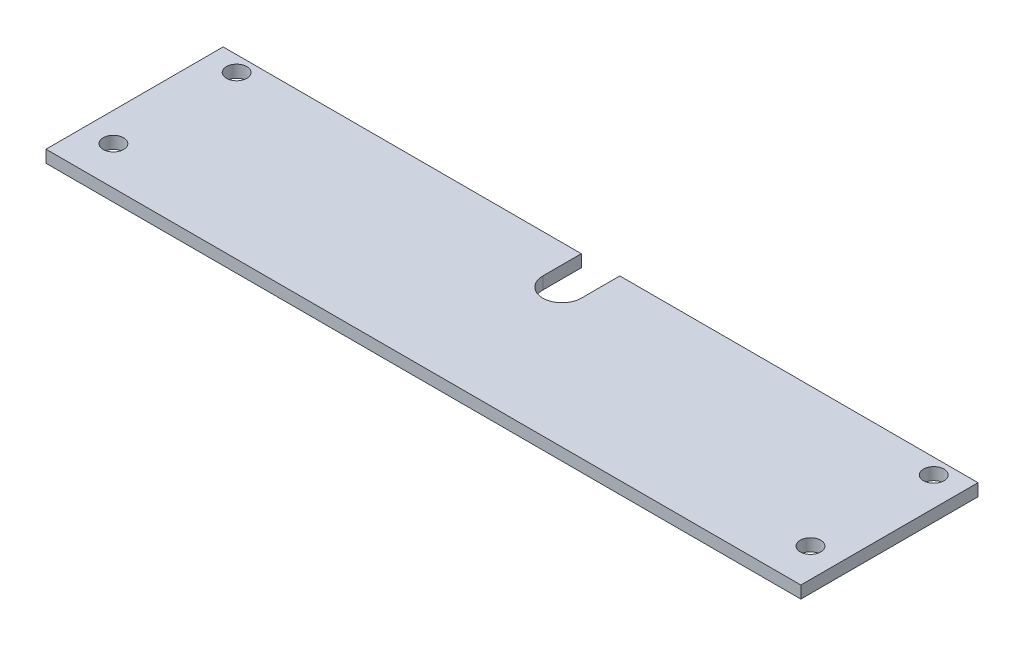
ISO-10303-21;
HEADER;
FILE_DESCRIPTION(('STEP AP214'),'2;1');
FILE_NAME('part.step','',(''),(''),'','','');
FILE_SCHEMA(('AUTOMOTIVE_DESIGN { 1 0 10303 214 1 1 1 1 }'));
ENDSEC;
DATA;
#1=APPLICATION_CONTEXT('core data for automotive mechanical design processes');
#2=APPLICATION_PROTOCOL_DEFINITION('international standard','automotive_design',2000,#1);
#3=PRODUCT_CONTEXT('',#1,'mechanical');
#4=PRODUCT('Part','Part','',(#3));
#5=PRODUCT_RELATED_PRODUCT_CATEGORY('part','',(#4));
#6=PRODUCT_DEFINITION_FORMATION('','',#4);
#7=PRODUCT_DEFINITION_CONTEXT('part definition',#1,'design');
#8=PRODUCT_DEFINITION('design','',#6,#7);
#9=PRODUCT_DEFINITION_SHAPE('','',#8);
#10=(LENGTH_UNIT() NAMED_UNIT(*) SI_UNIT(.MILLI.,.METRE.));
#11=(NAMED_UNIT(*) PLANE_ANGLE_UNIT() SI_UNIT($,.RADIAN.));
#12=(NAMED_UNIT(*) SI_UNIT($,.STERADIAN.) SOLID_ANGLE_UNIT());
#13=UNCERTAINTY_MEASURE_WITH_UNIT(LENGTH_MEASURE(1.E-05),#10,'distance_accuracy_value','');
#14=(GEOMETRIC_REPRESENTATION_CONTEXT(3) GLOBAL_UNCERTAINTY_ASSIGNED_CONTEXT((#13)) GLOBAL_UNIT_ASSIGNED_CONTEXT((#10,
#11,#12)) REPRESENTATION_CONTEXT('',''));
#15=CARTESIAN_POINT('',(0.,0.,0.));
#16=DIRECTION('',(0.,0.,1.));
#17=DIRECTION('',(1.,0.,0.));
#18=AXIS2_PLACEMENT_3D('',#15,#16,#17);
#19=CARTESIAN_POINT('',(0.,3.175,0.));
#20=DIRECTION('',(0.,-1.,0.));
#21=DIRECTION('',(0.,0.,-1.));
#22=AXIS2_PLACEMENT_3D('',#19,#20,#21);
#23=PLANE('',#22);
#24=CARTESIAN_POINT('',(188.5,3.175,-10.));
#25=DIRECTION('',(0.,1.,0.));
#26=DIRECTION('',(0.,0.,1.));
#27=AXIS2_PLACEMENT_3D('',#24,#25,#26);
#28=CIRCLE('',#27,2.65000000000001);
#29=CARTESIAN_POINT('',(188.5,3.175,-7.34999999999999));
#30=VERTEX_POINT('',#29);
#31=EDGE_CURVE('E247',#30,#30,#28,.T.);
#32=ORIENTED_EDGE('',*,*,#31,.F.);
#33=EDGE_LOOP('',(#32));
#34=FACE_BOUND('',#33,.T.);
#35=CARTESIAN_POINT('',(7.5,3.175,-42.));
#36=DIRECTION('',(0.,1.,0.));
#37=DIRECTION('',(0.,0.,1.));
#38=AXIS2_PLACEMENT_3D('',#35,#36,#37);
#39=CIRCLE('',#38,2.65);
#40=CARTESIAN_POINT('',(7.5,3.175,-39.35));
#41=VERTEX_POINT('',#40);
#42=EDGE_CURVE('E233',#41,#41,#39,.T.);
#43=ORIENTED_EDGE('',*,*,#42,.F.);
#44=EDGE_LOOP('',(#43));
#45=FACE_BOUND('',#44,.T.);
#46=DIRECTION('',(0.,0.,-1.));
#47=VECTOR('',#46,1.);
#48=CARTESIAN_POINT('',(93.,3.175,0.));
#49=LINE('',#48,#47);
#50=CARTESIAN_POINT('',(93.,3.175,-36.));
#51=VERTEX_POINT('',#50);
#52=CARTESIAN_POINT('',(93.,3.175,-46.));
#53=VERTEX_POINT('',#52);
#54=EDGE_CURVE('E125',#51,#53,#49,.T.);
#55=ORIENTED_EDGE('',*,*,#54,.T.);
#56=DIRECTION('',(-1.,0.,0.));
#57=VECTOR('',#56,1.);
#58=CARTESIAN_POINT('',(0.,3.175,-46.));
#59=LINE('',#58,#57);
#60=CARTESIAN_POINT('',(0.,3.175,-46.));
#61=VERTEX_POINT('',#60);
#62=EDGE_CURVE('E70',#53,#61,#59,.T.);
#63=ORIENTED_EDGE('',*,*,#62,.T.);
#64=DIRECTION('',(0.,0.,1.));
#65=VECTOR('',#64,1.);
#66=CARTESIAN_POINT('',(0.,3.175,0.));
#67=LINE('',#66,#65);
#68=CARTESIAN_POINT('',(0.,3.175,0.));
#69=VERTEX_POINT('',#68);
#70=EDGE_CURVE('E156',#61,#69,#67,.T.);
#71=ORIENTED_EDGE('',*,*,#70,.T.);
#72=DIRECTION('',(1.,0.,0.));
#73=VECTOR('',#72,1.);
#74=CARTESIAN_POINT('',(0.,3.175,0.));
#75=LINE('',#74,#73);
#76=CARTESIAN_POINT('',(196.,3.175,0.));
#77=VERTEX_POINT('',#76);
#78=EDGE_CURVE('E99',#69,#77,#75,.T.);
#79=ORIENTED_EDGE('',*,*,#78,.T.);
#80=DIRECTION('',(0.,0.,-1.));
#81=VECTOR('',#80,1.);
#82=CARTESIAN_POINT('',(196.,3.175,0.));
#83=LINE('',#82,#81);
#84=CARTESIAN_POINT('',(196.,3.175,-46.));
#85=VERTEX_POINT('',#84);
#86=EDGE_CURVE('E160',#77,#85,#83,.T.);
#87=ORIENTED_EDGE('',*,*,#86,.T.);
#88=CARTESIAN_POINT('',(103.,3.175,-46.));
#89=VERTEX_POINT('',#88);
#90=EDGE_CURVE('E162',#85,#89,#59,.T.);
#91=ORIENTED_EDGE('',*,*,#90,.T.);
#92=DIRECTION('',(0.,0.,1.));
#93=VECTOR('',#92,1.);
#94=CARTESIAN_POINT('',(103.,3.175,0.));
#95=LINE('',#94,#93);
#96=CARTESIAN_POINT('',(103.,3.175,-36.));
#97=VERTEX_POINT('',#96);
#98=EDGE_CURVE('E137',#89,#97,#95,.T.);
#99=ORIENTED_EDGE('',*,*,#98,.T.);
#100=CARTESIAN_POINT('',(98.,3.175,-36.));
#101=DIRECTION('',(0.,1.,0.));
#102=DIRECTION('',(0.,0.,1.));
#103=AXIS2_PLACEMENT_3D('',#100,#101,#102);
#104=CIRCLE('',#103,5.);
#105=EDGE_CURVE('E140',#51,#97,#104,.T.);
#106=ORIENTED_EDGE('',*,*,#105,.F.);
#107=EDGE_LOOP('',(#55,#63,#71,#79,#87,#91,#99,#106));
#108=FACE_BOUND('',#107,.T.);
#109=CARTESIAN_POINT('',(188.5,3.175,-42.));
#110=DIRECTION('',(0.,1.,0.));
#111=DIRECTION('',(0.,0.,1.));
#112=AXIS2_PLACEMENT_3D('',#109,#110,#111);
#113=CIRCLE('',#112,2.65000000000001);
#114=CARTESIAN_POINT('',(188.5,3.175,-39.35));
#115=VERTEX_POINT('',#114);
#116=EDGE_CURVE('E237',#115,#115,#113,.T.);
#117=ORIENTED_EDGE('',*,*,#116,.F.);
#118=EDGE_LOOP('',(#117));
#119=FACE_BOUND('',#118,.T.);
#120=CARTESIAN_POINT('',(7.5,3.175,-10.));
#121=DIRECTION('',(0.,1.,0.));
#122=DIRECTION('',(0.,0.,1.));
#123=AXIS2_PLACEMENT_3D('',#120,#121,#122);
#124=CIRCLE('',#123,2.65);
#125=CARTESIAN_POINT('',(7.5,3.175,-7.35));
#126=VERTEX_POINT('',#125);
#127=EDGE_CURVE('E243',#126,#126,#124,.T.);
#128=ORIENTED_EDGE('',*,*,#127,.F.);
#129=EDGE_LOOP('',(#128));
#130=FACE_BOUND('',#129,.T.);
#131=ADVANCED_FACE('F46',(#34,#45,#108,#119,#130),#23,.F.);
#132=CARTESIAN_POINT('',(0.,3.175,-46.));
#133=DIRECTION('',(0.,0.,1.));
#134=DIRECTION('',(1.,0.,0.));
#135=AXIS2_PLACEMENT_3D('',#132,#133,#134);
#136=PLANE('',#135);
#137=DIRECTION('',(0.,1.,0.));
#138=VECTOR('',#137,1.);
#139=CARTESIAN_POINT('',(93.,0.,-46.));
#140=LINE('',#139,#138);
#141=CARTESIAN_POINT('',(93.,0.,-46.));
#142=VERTEX_POINT('',#141);
#143=EDGE_CURVE('E149',#142,#53,#140,.T.);
#144=ORIENTED_EDGE('',*,*,#143,.F.);
#145=DIRECTION('',(-1.,0.,0.));
#146=VECTOR('',#145,1.);
#147=CARTESIAN_POINT('',(0.,0.,-46.));
#148=LINE('',#147,#146);
#149=CARTESIAN_POINT('',(0.,0.,-46.));
#150=VERTEX_POINT('',#149);
#151=EDGE_CURVE('E92',#142,#150,#148,.T.);
#152=ORIENTED_EDGE('',*,*,#151,.T.);
#153=DIRECTION('',(0.,-1.,0.));
#154=VECTOR('',#153,1.);
#155=CARTESIAN_POINT('',(0.,3.175,-46.));
#156=LINE('',#155,#154);
#157=EDGE_CURVE('E165',#61,#150,#156,.T.);
#158=ORIENTED_EDGE('',*,*,#157,.F.);
#159=ORIENTED_EDGE('',*,*,#62,.F.);
#160=EDGE_LOOP('',(#144,#152,#158,#159));
#161=FACE_BOUND('',#160,.T.);
#162=ADVANCED_FACE('F199',(#161),#136,.F.);
#163=DIRECTION('',(0.,1.,0.));
#164=VECTOR('',#163,1.);
#165=CARTESIAN_POINT('',(103.,0.,-46.));
#166=LINE('',#165,#164);
#167=CARTESIAN_POINT('',(103.,0.,-46.));
#168=VERTEX_POINT('',#167);
#169=EDGE_CURVE('E152',#168,#89,#166,.T.);
#170=ORIENTED_EDGE('',*,*,#169,.T.);
#171=ORIENTED_EDGE('',*,*,#90,.F.);
#172=DIRECTION('',(0.,-1.,0.));
#173=VECTOR('',#172,1.);
#174=CARTESIAN_POINT('',(196.,3.175,-46.));
#175=LINE('',#174,#173);
#176=CARTESIAN_POINT('',(196.,0.,-46.));
#177=VERTEX_POINT('',#176);
#178=EDGE_CURVE('E175',#85,#177,#175,.T.);
#179=ORIENTED_EDGE('',*,*,#178,.T.);
#180=EDGE_CURVE('E158',#177,#168,#148,.T.);
#181=ORIENTED_EDGE('',*,*,#180,.T.);
#182=EDGE_LOOP('',(#170,#171,#179,#181));
#183=FACE_BOUND('',#182,.T.);
#184=ADVANCED_FACE('F185',(#183),#136,.F.);
#185=CARTESIAN_POINT('',(0.,0.,0.));
#186=DIRECTION('',(0.,-1.,0.));
#187=DIRECTION('',(0.,0.,-1.));
#188=AXIS2_PLACEMENT_3D('',#185,#186,#187);
#189=PLANE('',#188);
#190=CARTESIAN_POINT('',(188.5,0.,-10.));
#191=DIRECTION('',(0.,1.,0.));
#192=DIRECTION('',(0.,0.,1.));
#193=AXIS2_PLACEMENT_3D('',#190,#191,#192);
#194=CIRCLE('',#193,2.65000000000001);
#195=CARTESIAN_POINT('',(188.5,0.,-7.34999999999999));
#196=VERTEX_POINT('',#195);
#197=EDGE_CURVE('E221',#196,#196,#194,.T.);
#198=ORIENTED_EDGE('',*,*,#197,.T.);
#199=EDGE_LOOP('',(#198));
#200=FACE_BOUND('',#199,.T.);
#201=CARTESIAN_POINT('',(7.5,0.,-10.));
#202=DIRECTION('',(0.,1.,0.));
#203=DIRECTION('',(0.,0.,1.));
#204=AXIS2_PLACEMENT_3D('',#201,#202,#203);
#205=CIRCLE('',#204,2.65);
#206=CARTESIAN_POINT('',(7.5,0.,-7.35));
#207=VERTEX_POINT('',#206);
#208=EDGE_CURVE('E225',#207,#207,#205,.T.);
#209=ORIENTED_EDGE('',*,*,#208,.T.);
#210=EDGE_LOOP('',(#209));
#211=FACE_BOUND('',#210,.T.);
#212=CARTESIAN_POINT('',(188.5,0.,-42.));
#213=DIRECTION('',(0.,1.,0.));
#214=DIRECTION('',(0.,0.,1.));
#215=AXIS2_PLACEMENT_3D('',#212,#213,#214);
#216=CIRCLE('',#215,2.65000000000001);
#217=CARTESIAN_POINT('',(188.5,0.,-39.35));
#218=VERTEX_POINT('',#217);
#219=EDGE_CURVE('E229',#218,#218,#216,.T.);
#220=ORIENTED_EDGE('',*,*,#219,.T.);
#221=EDGE_LOOP('',(#220));
#222=FACE_BOUND('',#221,.T.);
#223=CARTESIAN_POINT('',(7.5,0.,-42.));
#224=DIRECTION('',(0.,1.,0.));
#225=DIRECTION('',(0.,0.,1.));
#226=AXIS2_PLACEMENT_3D('',#223,#224,#225);
#227=CIRCLE('',#226,2.65);
#228=CARTESIAN_POINT('',(7.5,0.,-39.35));
#229=VERTEX_POINT('',#228);
#230=EDGE_CURVE('E143',#229,#229,#227,.T.);
#231=ORIENTED_EDGE('',*,*,#230,.T.);
#232=EDGE_LOOP('',(#231));
#233=FACE_BOUND('',#232,.T.);
#234=ORIENTED_EDGE('',*,*,#151,.F.);
#235=DIRECTION('',(0.,0.,-1.));
#236=VECTOR('',#235,1.);
#237=CARTESIAN_POINT('',(93.,0.,0.));
#238=LINE('',#237,#236);
#239=CARTESIAN_POINT('',(93.,0.,-36.));
#240=VERTEX_POINT('',#239);
#241=EDGE_CURVE('E124',#240,#142,#238,.T.);
#242=ORIENTED_EDGE('',*,*,#241,.F.);
#243=CARTESIAN_POINT('',(98.,0.,-36.));
#244=DIRECTION('',(0.,1.,0.));
#245=DIRECTION('',(0.,0.,1.));
#246=AXIS2_PLACEMENT_3D('',#243,#244,#245);
#247=CIRCLE('',#246,5.);
#248=CARTESIAN_POINT('',(103.,0.,-36.));
#249=VERTEX_POINT('',#248);
#250=EDGE_CURVE('E130',#240,#249,#247,.T.);
#251=ORIENTED_EDGE('',*,*,#250,.T.);
#252=DIRECTION('',(0.,0.,1.));
#253=VECTOR('',#252,1.);
#254=CARTESIAN_POINT('',(103.,0.,0.));
#255=LINE('',#254,#253);
#256=EDGE_CURVE('E127',#168,#249,#255,.T.);
#257=ORIENTED_EDGE('',*,*,#256,.F.);
#258=ORIENTED_EDGE('',*,*,#180,.F.);
#259=DIRECTION('',(0.,0.,-1.));
#260=VECTOR('',#259,1.);
#261=CARTESIAN_POINT('',(196.,0.,0.));
#262=LINE('',#261,#260);
#263=CARTESIAN_POINT('',(196.,0.,0.));
#264=VERTEX_POINT('',#263);
#265=EDGE_CURVE('E170',#264,#177,#262,.T.);
#266=ORIENTED_EDGE('',*,*,#265,.F.);
#267=DIRECTION('',(1.,0.,0.));
#268=VECTOR('',#267,1.);
#269=CARTESIAN_POINT('',(0.,0.,0.));
#270=LINE('',#269,#268);
#271=CARTESIAN_POINT('',(0.,0.,0.));
#272=VERTEX_POINT('',#271);
#273=EDGE_CURVE('E168',#272,#264,#270,.T.);
#274=ORIENTED_EDGE('',*,*,#273,.F.);
#275=DIRECTION('',(0.,0.,1.));
#276=VECTOR('',#275,1.);
#277=CARTESIAN_POINT('',(0.,0.,0.));
#278=LINE('',#277,#276);
#279=EDGE_CURVE('E151',#150,#272,#278,.T.);
#280=ORIENTED_EDGE('',*,*,#279,.F.);
#281=EDGE_LOOP('',(#234,#242,#251,#257,#258,#266,#274,#280));
#282=FACE_BOUND('',#281,.T.);
#283=ADVANCED_FACE('F135',(#200,#211,#222,#233,#282),#189,.T.);
#284=CARTESIAN_POINT('',(0.,3.175,0.));
#285=DIRECTION('',(1.,0.,0.));
#286=DIRECTION('',(0.,0.,-1.));
#287=AXIS2_PLACEMENT_3D('',#284,#285,#286);
#288=PLANE('',#287);
#289=ORIENTED_EDGE('',*,*,#279,.T.);
#290=DIRECTION('',(0.,-1.,0.));
#291=VECTOR('',#290,1.);
#292=CARTESIAN_POINT('',(0.,3.175,0.));
#293=LINE('',#292,#291);
#294=EDGE_CURVE('E11',#69,#272,#293,.T.);
#295=ORIENTED_EDGE('',*,*,#294,.F.);
#296=ORIENTED_EDGE('',*,*,#70,.F.);
#297=ORIENTED_EDGE('',*,*,#157,.T.);
#298=EDGE_LOOP('',(#289,#295,#296,#297));
#299=FACE_BOUND('',#298,.T.);
#300=ADVANCED_FACE('F48',(#299),#288,.F.);
#301=CARTESIAN_POINT('',(0.,3.175,0.));
#302=DIRECTION('',(0.,0.,-1.));
#303=DIRECTION('',(-1.,0.,0.));
#304=AXIS2_PLACEMENT_3D('',#301,#302,#303);
#305=PLANE('',#304);
#306=ORIENTED_EDGE('',*,*,#273,.T.);
#307=DIRECTION('',(0.,-1.,0.));
#308=VECTOR('',#307,1.);
#309=CARTESIAN_POINT('',(196.,3.175,0.));
#310=LINE('',#309,#308);
#311=EDGE_CURVE('E54',#77,#264,#310,.T.);
#312=ORIENTED_EDGE('',*,*,#311,.F.);
#313=ORIENTED_EDGE('',*,*,#78,.F.);
#314=ORIENTED_EDGE('',*,*,#294,.T.);
#315=EDGE_LOOP('',(#306,#312,#313,#314));
#316=FACE_BOUND('',#315,.T.);
#317=ADVANCED_FACE('F191',(#316),#305,.F.);
#318=CARTESIAN_POINT('',(196.,3.175,0.));
#319=DIRECTION('',(-1.,0.,0.));
#320=DIRECTION('',(0.,0.,1.));
#321=AXIS2_PLACEMENT_3D('',#318,#319,#320);
#322=PLANE('',#321);
#323=ORIENTED_EDGE('',*,*,#265,.T.);
#324=ORIENTED_EDGE('',*,*,#178,.F.);
#325=ORIENTED_EDGE('',*,*,#86,.F.);
#326=ORIENTED_EDGE('',*,*,#311,.T.);
#327=EDGE_LOOP('',(#323,#324,#325,#326));
#328=FACE_BOUND('',#327,.T.);
#329=ADVANCED_FACE('F181',(#328),#322,.F.);
#330=CARTESIAN_POINT('',(93.,0.,0.));
#331=DIRECTION('',(1.,0.,0.));
#332=DIRECTION('',(0.,0.,-1.));
#333=AXIS2_PLACEMENT_3D('',#330,#331,#332);
#334=PLANE('',#333);
#335=ORIENTED_EDGE('',*,*,#54,.F.);
#336=DIRECTION('',(0.,1.,0.));
#337=VECTOR('',#336,1.);
#338=CARTESIAN_POINT('',(93.,0.,-36.));
#339=LINE('',#338,#337);
#340=EDGE_CURVE('E121',#240,#51,#339,.T.);
#341=ORIENTED_EDGE('',*,*,#340,.F.);
#342=ORIENTED_EDGE('',*,*,#241,.T.);
#343=ORIENTED_EDGE('',*,*,#143,.T.);
#344=EDGE_LOOP('',(#335,#341,#342,#343));
#345=FACE_BOUND('',#344,.T.);
#346=ADVANCED_FACE('F122',(#345),#334,.T.);
#347=CARTESIAN_POINT('',(103.,0.,0.));
#348=DIRECTION('',(-1.,0.,0.));
#349=DIRECTION('',(0.,0.,1.));
#350=AXIS2_PLACEMENT_3D('',#347,#348,#349);
#351=PLANE('',#350);
#352=ORIENTED_EDGE('',*,*,#98,.F.);
#353=ORIENTED_EDGE('',*,*,#169,.F.);
#354=ORIENTED_EDGE('',*,*,#256,.T.);
#355=DIRECTION('',(0.,1.,0.));
#356=VECTOR('',#355,1.);
#357=CARTESIAN_POINT('',(103.,0.,-36.));
#358=LINE('',#357,#356);
#359=EDGE_CURVE('E61',#249,#97,#358,.T.);
#360=ORIENTED_EDGE('',*,*,#359,.T.);
#361=EDGE_LOOP('',(#352,#353,#354,#360));
#362=FACE_BOUND('',#361,.T.);
#363=ADVANCED_FACE('F267',(#362),#351,.T.);
#364=CARTESIAN_POINT('',(98.,0.,-36.));
#365=DIRECTION('',(0.,1.,0.));
#366=DIRECTION('',(0.,0.,1.));
#367=AXIS2_PLACEMENT_3D('',#364,#365,#366);
#368=CYLINDRICAL_SURFACE('',#367,5.);
#369=ORIENTED_EDGE('',*,*,#105,.T.);
#370=ORIENTED_EDGE('',*,*,#359,.F.);
#371=ORIENTED_EDGE('',*,*,#250,.F.);
#372=ORIENTED_EDGE('',*,*,#340,.T.);
#373=EDGE_LOOP('',(#369,#370,#371,#372));
#374=FACE_BOUND('',#373,.T.);
#375=ADVANCED_FACE('F131',(#374),#368,.F.);
#376=CARTESIAN_POINT('',(7.5,3.175,-42.));
#377=DIRECTION('',(0.,1.,0.));
#378=DIRECTION('',(0.,0.,1.));
#379=AXIS2_PLACEMENT_3D('',#376,#377,#378);
#380=CYLINDRICAL_SURFACE('',#379,2.65);
#381=ORIENTED_EDGE('',*,*,#230,.F.);
#382=EDGE_LOOP('',(#381));
#383=FACE_BOUND('',#382,.T.);
#384=ORIENTED_EDGE('',*,*,#42,.T.);
#385=EDGE_LOOP('',(#384));
#386=FACE_BOUND('',#385,.T.);
#387=ADVANCED_FACE('F264',(#383,#386),#380,.F.);
#388=CARTESIAN_POINT('',(188.5,3.175,-42.));
#389=DIRECTION('',(0.,1.,0.));
#390=DIRECTION('',(0.,0.,1.));
#391=AXIS2_PLACEMENT_3D('',#388,#389,#390);
#392=CYLINDRICAL_SURFACE('',#391,2.65000000000001);
#393=ORIENTED_EDGE('',*,*,#219,.F.);
#394=EDGE_LOOP('',(#393));
#395=FACE_BOUND('',#394,.T.);
#396=ORIENTED_EDGE('',*,*,#116,.T.);
#397=EDGE_LOOP('',(#396));
#398=FACE_BOUND('',#397,.T.);
#399=ADVANCED_FACE('F258',(#395,#398),#392,.F.);
#400=CARTESIAN_POINT('',(7.5,3.175,-10.));
#401=DIRECTION('',(0.,1.,0.));
#402=DIRECTION('',(0.,0.,1.));
#403=AXIS2_PLACEMENT_3D('',#400,#401,#402);
#404=CYLINDRICAL_SURFACE('',#403,2.65);
#405=ORIENTED_EDGE('',*,*,#208,.F.);
#406=EDGE_LOOP('',(#405));
#407=FACE_BOUND('',#406,.T.);
#408=ORIENTED_EDGE('',*,*,#127,.T.);
#409=EDGE_LOOP('',(#408));
#410=FACE_BOUND('',#409,.T.);
#411=ADVANCED_FACE('F252',(#407,#410),#404,.F.);
#412=CARTESIAN_POINT('',(188.5,3.175,-10.));
#413=DIRECTION('',(0.,1.,0.));
#414=DIRECTION('',(0.,0.,1.));
#415=AXIS2_PLACEMENT_3D('',#412,#413,#414);
#416=CYLINDRICAL_SURFACE('',#415,2.65000000000001);
#417=ORIENTED_EDGE('',*,*,#197,.F.);
#418=EDGE_LOOP('',(#417));
#419=FACE_BOUND('',#418,.T.);
#420=ORIENTED_EDGE('',*,*,#31,.T.);
#421=EDGE_LOOP('',(#420));
#422=FACE_BOUND('',#421,.T.);
#423=ADVANCED_FACE('F250',(#419,#422),#416,.F.);
#424=CLOSED_SHELL('',(#131,#162,#184,#283,#300,#317,#329,#346,#363,#375,#387,#399,#411,#423));
#425=MANIFOLD_SOLID_BREP('B2',#424);
#426=ADVANCED_BREP_SHAPE_REPRESENTATION('',(#18,#425),#14);
#427=SHAPE_DEFINITION_REPRESENTATION(#9,#426);
ENDSEC;
END-ISO-10303-21;
